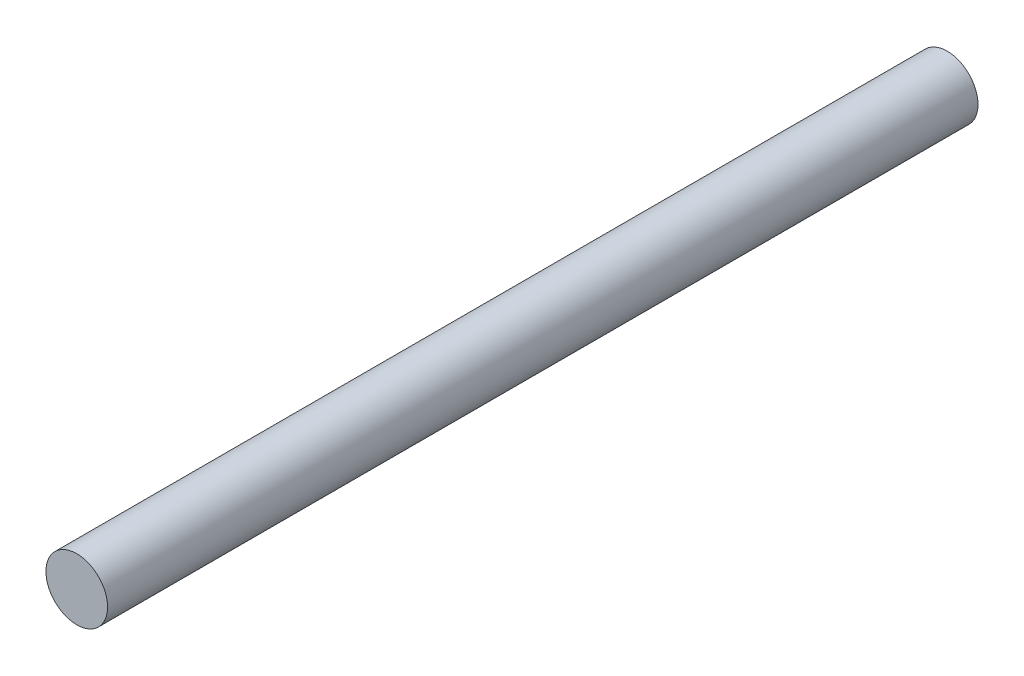
ISO-10303-21;
HEADER;
FILE_DESCRIPTION(('STEP AP214'),'2;1');
FILE_NAME('part.step','',(''),(''),'','','');
FILE_SCHEMA(('AUTOMOTIVE_DESIGN { 1 0 10303 214 1 1 1 1 }'));
ENDSEC;
DATA;
#1=APPLICATION_CONTEXT('core data for automotive mechanical design processes');
#2=APPLICATION_PROTOCOL_DEFINITION('international standard','automotive_design',2000,#1);
#3=PRODUCT_CONTEXT('',#1,'mechanical');
#4=PRODUCT('Part','Part','',(#3));
#5=PRODUCT_RELATED_PRODUCT_CATEGORY('part','',(#4));
#6=PRODUCT_DEFINITION_FORMATION('','',#4);
#7=PRODUCT_DEFINITION_CONTEXT('part definition',#1,'design');
#8=PRODUCT_DEFINITION('design','',#6,#7);
#9=PRODUCT_DEFINITION_SHAPE('','',#8);
#10=(LENGTH_UNIT() NAMED_UNIT(*) SI_UNIT(.MILLI.,.METRE.));
#11=(NAMED_UNIT(*) PLANE_ANGLE_UNIT() SI_UNIT($,.RADIAN.));
#12=(NAMED_UNIT(*) SI_UNIT($,.STERADIAN.) SOLID_ANGLE_UNIT());
#13=UNCERTAINTY_MEASURE_WITH_UNIT(LENGTH_MEASURE(1.E-05),#10,'distance_accuracy_value','');
#14=(GEOMETRIC_REPRESENTATION_CONTEXT(3) GLOBAL_UNCERTAINTY_ASSIGNED_CONTEXT((#13)) GLOBAL_UNIT_ASSIGNED_CONTEXT((#10,
#11,#12)) REPRESENTATION_CONTEXT('',''));
#15=CARTESIAN_POINT('',(0.,0.,0.));
#16=DIRECTION('',(0.,0.,1.));
#17=DIRECTION('',(1.,0.,0.));
#18=AXIS2_PLACEMENT_3D('',#15,#16,#17);
#19=CARTESIAN_POINT('',(0.,0.,113.));
#20=DIRECTION('',(0.,0.,-1.));
#21=DIRECTION('',(-1.,0.,0.));
#22=AXIS2_PLACEMENT_3D('',#19,#20,#21);
#23=CYLINDRICAL_SURFACE('',#22,4.);
#24=CARTESIAN_POINT('',(0.,0.,113.));
#25=DIRECTION('',(0.,0.,1.));
#26=DIRECTION('',(1.,0.,0.));
#27=AXIS2_PLACEMENT_3D('',#24,#25,#26);
#28=CIRCLE('',#27,4.);
#29=CARTESIAN_POINT('',(4.,0.,113.));
#30=VERTEX_POINT('',#29);
#31=EDGE_CURVE('E10',#30,#30,#28,.T.);
#32=ORIENTED_EDGE('',*,*,#31,.F.);
#33=EDGE_LOOP('',(#32));
#34=FACE_BOUND('',#33,.T.);
#35=CARTESIAN_POINT('',(0.,0.,0.));
#36=DIRECTION('',(0.,0.,1.));
#37=DIRECTION('',(1.,0.,0.));
#38=AXIS2_PLACEMENT_3D('',#35,#36,#37);
#39=CIRCLE('',#38,4.);
#40=CARTESIAN_POINT('',(4.,0.,0.));
#41=VERTEX_POINT('',#40);
#42=EDGE_CURVE('E40',#41,#41,#39,.T.);
#43=ORIENTED_EDGE('',*,*,#42,.T.);
#44=EDGE_LOOP('',(#43));
#45=FACE_BOUND('',#44,.T.);
#46=ADVANCED_FACE('F37',(#34,#45),#23,.T.);
#47=CARTESIAN_POINT('',(0.,0.,113.));
#48=DIRECTION('',(0.,0.,1.));
#49=DIRECTION('',(1.,0.,0.));
#50=AXIS2_PLACEMENT_3D('',#47,#48,#49);
#51=PLANE('',#50);
#52=ORIENTED_EDGE('',*,*,#31,.T.);
#53=EDGE_LOOP('',(#52));
#54=FACE_BOUND('',#53,.T.);
#55=ADVANCED_FACE('F54',(#54),#51,.T.);
#56=CARTESIAN_POINT('',(0.,0.,0.));
#57=DIRECTION('',(0.,0.,1.));
#58=DIRECTION('',(1.,0.,0.));
#59=AXIS2_PLACEMENT_3D('',#56,#57,#58);
#60=PLANE('',#59);
#61=ORIENTED_EDGE('',*,*,#42,.F.);
#62=EDGE_LOOP('',(#61));
#63=FACE_BOUND('',#62,.T.);
#64=ADVANCED_FACE('F52',(#63),#60,.F.);
#65=CLOSED_SHELL('',(#46,#55,#64));
#66=MANIFOLD_SOLID_BREP('B2',#65);
#67=ADVANCED_BREP_SHAPE_REPRESENTATION('',(#18,#66),#14);
#68=SHAPE_DEFINITION_REPRESENTATION(#9,#67);
ENDSEC;
END-ISO-10303-21;
